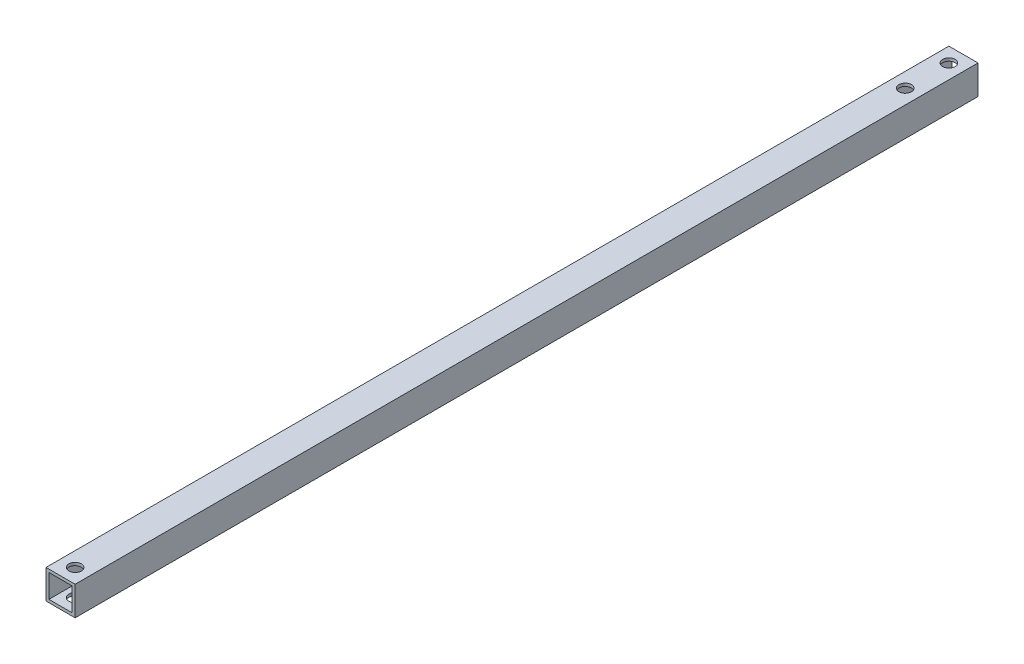
ISO-10303-21;
HEADER;
FILE_DESCRIPTION(('STEP AP214'),'2;1');
FILE_NAME('part.step','',(''),(''),'','','');
FILE_SCHEMA(('AUTOMOTIVE_DESIGN { 1 0 10303 214 1 1 1 1 }'));
ENDSEC;
DATA;
#1=APPLICATION_CONTEXT('core data for automotive mechanical design processes');
#2=APPLICATION_PROTOCOL_DEFINITION('international standard','automotive_design',2000,#1);
#3=PRODUCT_CONTEXT('',#1,'mechanical');
#4=PRODUCT('Part','Part','',(#3));
#5=PRODUCT_RELATED_PRODUCT_CATEGORY('part','',(#4));
#6=PRODUCT_DEFINITION_FORMATION('','',#4);
#7=PRODUCT_DEFINITION_CONTEXT('part definition',#1,'design');
#8=PRODUCT_DEFINITION('design','',#6,#7);
#9=PRODUCT_DEFINITION_SHAPE('','',#8);
#10=(LENGTH_UNIT() NAMED_UNIT(*) SI_UNIT(.MILLI.,.METRE.));
#11=(NAMED_UNIT(*) PLANE_ANGLE_UNIT() SI_UNIT($,.RADIAN.));
#12=(NAMED_UNIT(*) SI_UNIT($,.STERADIAN.) SOLID_ANGLE_UNIT());
#13=UNCERTAINTY_MEASURE_WITH_UNIT(LENGTH_MEASURE(1.E-05),#10,'distance_accuracy_value','');
#14=(GEOMETRIC_REPRESENTATION_CONTEXT(3) GLOBAL_UNCERTAINTY_ASSIGNED_CONTEXT((#13)) GLOBAL_UNIT_ASSIGNED_CONTEXT((#10,
#11,#12)) REPRESENTATION_CONTEXT('',''));
#15=CARTESIAN_POINT('',(0.,0.,0.));
#16=DIRECTION('',(0.,0.,1.));
#17=DIRECTION('',(1.,0.,0.));
#18=AXIS2_PLACEMENT_3D('',#15,#16,#17);
#19=CARTESIAN_POINT('',(0.,0.,310.));
#20=DIRECTION('',(0.,0.,1.));
#21=DIRECTION('',(1.,0.,0.));
#22=AXIS2_PLACEMENT_3D('',#19,#20,#21);
#23=PLANE('',#22);
#24=DIRECTION('',(0.,-1.,0.));
#25=VECTOR('',#24,1.);
#26=CARTESIAN_POINT('',(0.,0.,310.));
#27=LINE('',#26,#25);
#28=CARTESIAN_POINT('',(0.,10.,310.));
#29=VERTEX_POINT('',#28);
#30=CARTESIAN_POINT('',(0.,0.,310.));
#31=VERTEX_POINT('',#30);
#32=EDGE_CURVE('E164',#29,#31,#27,.T.);
#33=ORIENTED_EDGE('',*,*,#32,.T.);
#34=DIRECTION('',(1.,0.,0.));
#35=VECTOR('',#34,1.);
#36=CARTESIAN_POINT('',(0.,0.,310.));
#37=LINE('',#36,#35);
#38=CARTESIAN_POINT('',(10.,0.,310.));
#39=VERTEX_POINT('',#38);
#40=EDGE_CURVE('E167',#31,#39,#37,.T.);
#41=ORIENTED_EDGE('',*,*,#40,.T.);
#42=DIRECTION('',(0.,1.,0.));
#43=VECTOR('',#42,1.);
#44=CARTESIAN_POINT('',(10.,0.,310.));
#45=LINE('',#44,#43);
#46=CARTESIAN_POINT('',(10.,10.,310.));
#47=VERTEX_POINT('',#46);
#48=EDGE_CURVE('E170',#39,#47,#45,.T.);
#49=ORIENTED_EDGE('',*,*,#48,.T.);
#50=DIRECTION('',(-1.,0.,0.));
#51=VECTOR('',#50,1.);
#52=CARTESIAN_POINT('',(0.,10.,310.));
#53=LINE('',#52,#51);
#54=EDGE_CURVE('E172',#47,#29,#53,.T.);
#55=ORIENTED_EDGE('',*,*,#54,.T.);
#56=EDGE_LOOP('',(#33,#41,#49,#55));
#57=FACE_BOUND('',#56,.T.);
#58=DIRECTION('',(1.,0.,0.));
#59=VECTOR('',#58,1.);
#60=CARTESIAN_POINT('',(0.,1.,310.));
#61=LINE('',#60,#59);
#62=CARTESIAN_POINT('',(1.,1.,310.));
#63=VERTEX_POINT('',#62);
#64=CARTESIAN_POINT('',(9.,1.,310.));
#65=VERTEX_POINT('',#64);
#66=EDGE_CURVE('E134',#63,#65,#61,.T.);
#67=ORIENTED_EDGE('',*,*,#66,.F.);
#68=DIRECTION('',(0.,-1.,0.));
#69=VECTOR('',#68,1.);
#70=CARTESIAN_POINT('',(1.,0.,310.));
#71=LINE('',#70,#69);
#72=CARTESIAN_POINT('',(1.,9.,310.));
#73=VERTEX_POINT('',#72);
#74=EDGE_CURVE('E126',#73,#63,#71,.T.);
#75=ORIENTED_EDGE('',*,*,#74,.F.);
#76=DIRECTION('',(-1.,0.,0.));
#77=VECTOR('',#76,1.);
#78=CARTESIAN_POINT('',(0.,9.,310.));
#79=LINE('',#78,#77);
#80=CARTESIAN_POINT('',(9.,9.,310.));
#81=VERTEX_POINT('',#80);
#82=EDGE_CURVE('E148',#81,#73,#79,.T.);
#83=ORIENTED_EDGE('',*,*,#82,.F.);
#84=DIRECTION('',(0.,1.,0.));
#85=VECTOR('',#84,1.);
#86=CARTESIAN_POINT('',(9.,0.,310.));
#87=LINE('',#86,#85);
#88=EDGE_CURVE('E146',#65,#81,#87,.T.);
#89=ORIENTED_EDGE('',*,*,#88,.F.);
#90=EDGE_LOOP('',(#67,#75,#83,#89));
#91=FACE_BOUND('',#90,.T.);
#92=ADVANCED_FACE('F59',(#57,#91),#23,.T.);
#93=CARTESIAN_POINT('',(0.,0.,0.));
#94=DIRECTION('',(0.,0.,1.));
#95=DIRECTION('',(1.,0.,0.));
#96=AXIS2_PLACEMENT_3D('',#93,#94,#95);
#97=PLANE('',#96);
#98=DIRECTION('',(0.,-1.,0.));
#99=VECTOR('',#98,1.);
#100=CARTESIAN_POINT('',(0.,0.,0.));
#101=LINE('',#100,#99);
#102=CARTESIAN_POINT('',(0.,10.,0.));
#103=VERTEX_POINT('',#102);
#104=CARTESIAN_POINT('',(0.,0.,0.));
#105=VERTEX_POINT('',#104);
#106=EDGE_CURVE('E142',#103,#105,#101,.T.);
#107=ORIENTED_EDGE('',*,*,#106,.F.);
#108=DIRECTION('',(-1.,0.,0.));
#109=VECTOR('',#108,1.);
#110=CARTESIAN_POINT('',(0.,10.,0.));
#111=LINE('',#110,#109);
#112=CARTESIAN_POINT('',(10.,10.,0.));
#113=VERTEX_POINT('',#112);
#114=EDGE_CURVE('E168',#113,#103,#111,.T.);
#115=ORIENTED_EDGE('',*,*,#114,.F.);
#116=DIRECTION('',(0.,1.,0.));
#117=VECTOR('',#116,1.);
#118=CARTESIAN_POINT('',(10.,0.,0.));
#119=LINE('',#118,#117);
#120=CARTESIAN_POINT('',(10.,0.,0.));
#121=VERTEX_POINT('',#120);
#122=EDGE_CURVE('E179',#121,#113,#119,.T.);
#123=ORIENTED_EDGE('',*,*,#122,.F.);
#124=DIRECTION('',(1.,0.,0.));
#125=VECTOR('',#124,1.);
#126=CARTESIAN_POINT('',(0.,0.,0.));
#127=LINE('',#126,#125);
#128=EDGE_CURVE('E177',#105,#121,#127,.T.);
#129=ORIENTED_EDGE('',*,*,#128,.F.);
#130=EDGE_LOOP('',(#107,#115,#123,#129));
#131=FACE_BOUND('',#130,.T.);
#132=DIRECTION('',(0.,-1.,0.));
#133=VECTOR('',#132,1.);
#134=CARTESIAN_POINT('',(1.,0.,0.));
#135=LINE('',#134,#133);
#136=CARTESIAN_POINT('',(1.,9.,0.));
#137=VERTEX_POINT('',#136);
#138=CARTESIAN_POINT('',(1.,1.,0.));
#139=VERTEX_POINT('',#138);
#140=EDGE_CURVE('E84',#137,#139,#135,.T.);
#141=ORIENTED_EDGE('',*,*,#140,.T.);
#142=DIRECTION('',(1.,0.,0.));
#143=VECTOR('',#142,1.);
#144=CARTESIAN_POINT('',(0.,1.,0.));
#145=LINE('',#144,#143);
#146=CARTESIAN_POINT('',(9.,1.,0.));
#147=VERTEX_POINT('',#146);
#148=EDGE_CURVE('E141',#139,#147,#145,.T.);
#149=ORIENTED_EDGE('',*,*,#148,.T.);
#150=DIRECTION('',(0.,1.,0.));
#151=VECTOR('',#150,1.);
#152=CARTESIAN_POINT('',(9.,0.,0.));
#153=LINE('',#152,#151);
#154=CARTESIAN_POINT('',(9.,9.,0.));
#155=VERTEX_POINT('',#154);
#156=EDGE_CURVE('E156',#147,#155,#153,.T.);
#157=ORIENTED_EDGE('',*,*,#156,.T.);
#158=DIRECTION('',(-1.,0.,0.));
#159=VECTOR('',#158,1.);
#160=CARTESIAN_POINT('',(0.,9.,0.));
#161=LINE('',#160,#159);
#162=EDGE_CURVE('E135',#155,#137,#161,.T.);
#163=ORIENTED_EDGE('',*,*,#162,.T.);
#164=EDGE_LOOP('',(#141,#149,#157,#163));
#165=FACE_BOUND('',#164,.T.);
#166=ADVANCED_FACE('F226',(#131,#165),#97,.F.);
#167=CARTESIAN_POINT('',(0.,0.,310.));
#168=DIRECTION('',(1.,0.,0.));
#169=DIRECTION('',(0.,0.,-1.));
#170=AXIS2_PLACEMENT_3D('',#167,#168,#169);
#171=PLANE('',#170);
#172=ORIENTED_EDGE('',*,*,#106,.T.);
#173=DIRECTION('',(0.,0.,-1.));
#174=VECTOR('',#173,1.);
#175=CARTESIAN_POINT('',(0.,0.,310.));
#176=LINE('',#175,#174);
#177=EDGE_CURVE('E12',#31,#105,#176,.T.);
#178=ORIENTED_EDGE('',*,*,#177,.F.);
#179=ORIENTED_EDGE('',*,*,#32,.F.);
#180=DIRECTION('',(0.,0.,-1.));
#181=VECTOR('',#180,1.);
#182=CARTESIAN_POINT('',(0.,10.,310.));
#183=LINE('',#182,#181);
#184=EDGE_CURVE('E174',#29,#103,#183,.T.);
#185=ORIENTED_EDGE('',*,*,#184,.T.);
#186=EDGE_LOOP('',(#172,#178,#179,#185));
#187=FACE_BOUND('',#186,.T.);
#188=ADVANCED_FACE('F61',(#187),#171,.F.);
#189=CARTESIAN_POINT('',(0.,0.,310.));
#190=DIRECTION('',(0.,1.,0.));
#191=DIRECTION('',(0.,0.,1.));
#192=AXIS2_PLACEMENT_3D('',#189,#190,#191);
#193=PLANE('',#192);
#194=CARTESIAN_POINT('',(5.00000000000004,0.,305.));
#195=DIRECTION('',(0.,1.,0.));
#196=DIRECTION('',(0.,0.,1.));
#197=AXIS2_PLACEMENT_3D('',#194,#195,#196);
#198=CIRCLE('',#197,2.15000000000003);
#199=CARTESIAN_POINT('',(5.00000000000004,0.,307.15));
#200=VERTEX_POINT('',#199);
#201=EDGE_CURVE('E192',#200,#200,#198,.F.);
#202=ORIENTED_EDGE('',*,*,#201,.F.);
#203=EDGE_LOOP('',(#202));
#204=FACE_BOUND('',#203,.T.);
#205=CARTESIAN_POINT('',(5.00000000000003,0.,5.));
#206=DIRECTION('',(0.,1.,0.));
#207=DIRECTION('',(0.,0.,1.));
#208=AXIS2_PLACEMENT_3D('',#205,#206,#207);
#209=CIRCLE('',#208,2.15000000000001);
#210=CARTESIAN_POINT('',(5.00000000000003,0.,7.15000000000001));
#211=VERTEX_POINT('',#210);
#212=EDGE_CURVE('E265',#211,#211,#209,.F.);
#213=ORIENTED_EDGE('',*,*,#212,.F.);
#214=EDGE_LOOP('',(#213));
#215=FACE_BOUND('',#214,.T.);
#216=CARTESIAN_POINT('',(5.,0.,20.));
#217=DIRECTION('',(0.,1.,0.));
#218=DIRECTION('',(0.,0.,1.));
#219=AXIS2_PLACEMENT_3D('',#216,#217,#218);
#220=CIRCLE('',#219,2.15);
#221=CARTESIAN_POINT('',(5.,0.,22.15));
#222=VERTEX_POINT('',#221);
#223=EDGE_CURVE('E205',#222,#222,#220,.F.);
#224=ORIENTED_EDGE('',*,*,#223,.F.);
#225=EDGE_LOOP('',(#224));
#226=FACE_BOUND('',#225,.T.);
#227=ORIENTED_EDGE('',*,*,#128,.T.);
#228=DIRECTION('',(0.,0.,-1.));
#229=VECTOR('',#228,1.);
#230=CARTESIAN_POINT('',(10.,0.,310.));
#231=LINE('',#230,#229);
#232=EDGE_CURVE('E68',#39,#121,#231,.T.);
#233=ORIENTED_EDGE('',*,*,#232,.F.);
#234=ORIENTED_EDGE('',*,*,#40,.F.);
#235=ORIENTED_EDGE('',*,*,#177,.T.);
#236=EDGE_LOOP('',(#227,#233,#234,#235));
#237=FACE_BOUND('',#236,.T.);
#238=ADVANCED_FACE('F251',(#204,#215,#226,#237),#193,.F.);
#239=CARTESIAN_POINT('',(10.,0.,310.));
#240=DIRECTION('',(-1.,0.,0.));
#241=DIRECTION('',(0.,0.,1.));
#242=AXIS2_PLACEMENT_3D('',#239,#240,#241);
#243=PLANE('',#242);
#244=ORIENTED_EDGE('',*,*,#122,.T.);
#245=DIRECTION('',(0.,0.,-1.));
#246=VECTOR('',#245,1.);
#247=CARTESIAN_POINT('',(10.,10.,310.));
#248=LINE('',#247,#246);
#249=EDGE_CURVE('E184',#47,#113,#248,.T.);
#250=ORIENTED_EDGE('',*,*,#249,.F.);
#251=ORIENTED_EDGE('',*,*,#48,.F.);
#252=ORIENTED_EDGE('',*,*,#232,.T.);
#253=EDGE_LOOP('',(#244,#250,#251,#252));
#254=FACE_BOUND('',#253,.T.);
#255=ADVANCED_FACE('F248',(#254),#243,.F.);
#256=CARTESIAN_POINT('',(0.,10.,310.));
#257=DIRECTION('',(0.,-1.,0.));
#258=DIRECTION('',(0.,0.,-1.));
#259=AXIS2_PLACEMENT_3D('',#256,#257,#258);
#260=PLANE('',#259);
#261=CARTESIAN_POINT('',(5.00000000000004,10.,305.));
#262=DIRECTION('',(0.,1.,0.));
#263=DIRECTION('',(0.,0.,1.));
#264=AXIS2_PLACEMENT_3D('',#261,#262,#263);
#265=CIRCLE('',#264,2.15000000000003);
#266=CARTESIAN_POINT('',(5.00000000000004,10.,307.15));
#267=VERTEX_POINT('',#266);
#268=EDGE_CURVE('E289',#267,#267,#265,.T.);
#269=ORIENTED_EDGE('',*,*,#268,.F.);
#270=EDGE_LOOP('',(#269));
#271=FACE_BOUND('',#270,.T.);
#272=CARTESIAN_POINT('',(5.00000000000003,10.,5.));
#273=DIRECTION('',(0.,1.,0.));
#274=DIRECTION('',(0.,0.,-1.));
#275=AXIS2_PLACEMENT_3D('',#272,#273,#274);
#276=CIRCLE('',#275,2.15000000000001);
#277=CARTESIAN_POINT('',(5.00000000000003,10.,2.85));
#278=VERTEX_POINT('',#277);
#279=EDGE_CURVE('E281',#278,#278,#276,.T.);
#280=ORIENTED_EDGE('',*,*,#279,.F.);
#281=EDGE_LOOP('',(#280));
#282=FACE_BOUND('',#281,.T.);
#283=CARTESIAN_POINT('',(5.,10.,20.));
#284=DIRECTION('',(0.,1.,0.));
#285=DIRECTION('',(0.,0.,1.));
#286=AXIS2_PLACEMENT_3D('',#283,#284,#285);
#287=CIRCLE('',#286,2.15);
#288=CARTESIAN_POINT('',(5.,10.,22.15));
#289=VERTEX_POINT('',#288);
#290=EDGE_CURVE('E282',#289,#289,#287,.T.);
#291=ORIENTED_EDGE('',*,*,#290,.F.);
#292=EDGE_LOOP('',(#291));
#293=FACE_BOUND('',#292,.T.);
#294=ORIENTED_EDGE('',*,*,#114,.T.);
#295=ORIENTED_EDGE('',*,*,#184,.F.);
#296=ORIENTED_EDGE('',*,*,#54,.F.);
#297=ORIENTED_EDGE('',*,*,#249,.T.);
#298=EDGE_LOOP('',(#294,#295,#296,#297));
#299=FACE_BOUND('',#298,.T.);
#300=ADVANCED_FACE('F245',(#271,#282,#293,#299),#260,.F.);
#301=CARTESIAN_POINT('',(1.,0.,310.));
#302=DIRECTION('',(1.,0.,0.));
#303=DIRECTION('',(0.,0.,-1.));
#304=AXIS2_PLACEMENT_3D('',#301,#302,#303);
#305=PLANE('',#304);
#306=ORIENTED_EDGE('',*,*,#140,.F.);
#307=DIRECTION('',(0.,0.,-1.));
#308=VECTOR('',#307,1.);
#309=CARTESIAN_POINT('',(1.,9.,310.));
#310=LINE('',#309,#308);
#311=EDGE_CURVE('E130',#73,#137,#310,.T.);
#312=ORIENTED_EDGE('',*,*,#311,.F.);
#313=ORIENTED_EDGE('',*,*,#74,.T.);
#314=DIRECTION('',(0.,0.,-1.));
#315=VECTOR('',#314,1.);
#316=CARTESIAN_POINT('',(1.,1.,310.));
#317=LINE('',#316,#315);
#318=EDGE_CURVE('E129',#63,#139,#317,.T.);
#319=ORIENTED_EDGE('',*,*,#318,.T.);
#320=EDGE_LOOP('',(#306,#312,#313,#319));
#321=FACE_BOUND('',#320,.T.);
#322=ADVANCED_FACE('F128',(#321),#305,.T.);
#323=CARTESIAN_POINT('',(0.,1.,310.));
#324=DIRECTION('',(0.,1.,0.));
#325=DIRECTION('',(0.,0.,1.));
#326=AXIS2_PLACEMENT_3D('',#323,#324,#325);
#327=PLANE('',#326);
#328=CARTESIAN_POINT('',(5.00000000000004,1.,305.));
#329=DIRECTION('',(0.,1.,0.));
#330=DIRECTION('',(0.,0.,1.));
#331=AXIS2_PLACEMENT_3D('',#328,#329,#330);
#332=CIRCLE('',#331,2.15000000000003);
#333=CARTESIAN_POINT('',(5.00000000000004,1.,307.15));
#334=VERTEX_POINT('',#333);
#335=EDGE_CURVE('E154',#334,#334,#332,.T.);
#336=ORIENTED_EDGE('',*,*,#335,.F.);
#337=EDGE_LOOP('',(#336));
#338=FACE_BOUND('',#337,.T.);
#339=CARTESIAN_POINT('',(5.00000000000003,1.,5.));
#340=DIRECTION('',(0.,1.,0.));
#341=DIRECTION('',(0.,0.,1.));
#342=AXIS2_PLACEMENT_3D('',#339,#340,#341);
#343=CIRCLE('',#342,2.15000000000001);
#344=CARTESIAN_POINT('',(5.00000000000003,1.,7.15000000000001));
#345=VERTEX_POINT('',#344);
#346=EDGE_CURVE('E195',#345,#345,#343,.T.);
#347=ORIENTED_EDGE('',*,*,#346,.F.);
#348=EDGE_LOOP('',(#347));
#349=FACE_BOUND('',#348,.T.);
#350=CARTESIAN_POINT('',(5.,1.,20.));
#351=DIRECTION('',(0.,1.,0.));
#352=DIRECTION('',(0.,0.,1.));
#353=AXIS2_PLACEMENT_3D('',#350,#351,#352);
#354=CIRCLE('',#353,2.15);
#355=CARTESIAN_POINT('',(5.,1.,22.15));
#356=VERTEX_POINT('',#355);
#357=EDGE_CURVE('E191',#356,#356,#354,.T.);
#358=ORIENTED_EDGE('',*,*,#357,.F.);
#359=EDGE_LOOP('',(#358));
#360=FACE_BOUND('',#359,.T.);
#361=ORIENTED_EDGE('',*,*,#148,.F.);
#362=ORIENTED_EDGE('',*,*,#318,.F.);
#363=ORIENTED_EDGE('',*,*,#66,.T.);
#364=DIRECTION('',(0.,0.,-1.));
#365=VECTOR('',#364,1.);
#366=CARTESIAN_POINT('',(9.,1.,310.));
#367=LINE('',#366,#365);
#368=EDGE_CURVE('E143',#65,#147,#367,.T.);
#369=ORIENTED_EDGE('',*,*,#368,.T.);
#370=EDGE_LOOP('',(#361,#362,#363,#369));
#371=FACE_BOUND('',#370,.T.);
#372=ADVANCED_FACE('F138',(#338,#349,#360,#371),#327,.T.);
#373=CARTESIAN_POINT('',(9.,0.,310.));
#374=DIRECTION('',(-1.,0.,0.));
#375=DIRECTION('',(0.,0.,1.));
#376=AXIS2_PLACEMENT_3D('',#373,#374,#375);
#377=PLANE('',#376);
#378=ORIENTED_EDGE('',*,*,#156,.F.);
#379=ORIENTED_EDGE('',*,*,#368,.F.);
#380=ORIENTED_EDGE('',*,*,#88,.T.);
#381=DIRECTION('',(0.,0.,-1.));
#382=VECTOR('',#381,1.);
#383=CARTESIAN_POINT('',(9.,9.,310.));
#384=LINE('',#383,#382);
#385=EDGE_CURVE('E76',#81,#155,#384,.T.);
#386=ORIENTED_EDGE('',*,*,#385,.T.);
#387=EDGE_LOOP('',(#378,#379,#380,#386));
#388=FACE_BOUND('',#387,.T.);
#389=ADVANCED_FACE('F220',(#388),#377,.T.);
#390=CARTESIAN_POINT('',(0.,9.,310.));
#391=DIRECTION('',(0.,-1.,0.));
#392=DIRECTION('',(0.,0.,-1.));
#393=AXIS2_PLACEMENT_3D('',#390,#391,#392);
#394=PLANE('',#393);
#395=CARTESIAN_POINT('',(5.00000000000004,9.,305.));
#396=DIRECTION('',(0.,-1.,0.));
#397=DIRECTION('',(0.,0.,-1.));
#398=AXIS2_PLACEMENT_3D('',#395,#396,#397);
#399=CIRCLE('',#398,2.15000000000003);
#400=CARTESIAN_POINT('',(5.00000000000004,9.,302.85));
#401=VERTEX_POINT('',#400);
#402=EDGE_CURVE('E63',#401,#401,#399,.T.);
#403=ORIENTED_EDGE('',*,*,#402,.F.);
#404=EDGE_LOOP('',(#403));
#405=FACE_BOUND('',#404,.T.);
#406=CARTESIAN_POINT('',(5.00000000000003,9.,5.));
#407=DIRECTION('',(0.,-1.,0.));
#408=DIRECTION('',(0.,0.,-1.));
#409=AXIS2_PLACEMENT_3D('',#406,#407,#408);
#410=CIRCLE('',#409,2.15000000000001);
#411=CARTESIAN_POINT('',(5.00000000000003,9.,2.85));
#412=VERTEX_POINT('',#411);
#413=EDGE_CURVE('E193',#412,#412,#410,.T.);
#414=ORIENTED_EDGE('',*,*,#413,.F.);
#415=EDGE_LOOP('',(#414));
#416=FACE_BOUND('',#415,.T.);
#417=CARTESIAN_POINT('',(5.,9.,20.));
#418=DIRECTION('',(0.,-1.,0.));
#419=DIRECTION('',(0.,0.,-1.));
#420=AXIS2_PLACEMENT_3D('',#417,#418,#419);
#421=CIRCLE('',#420,2.15);
#422=CARTESIAN_POINT('',(5.,9.,17.85));
#423=VERTEX_POINT('',#422);
#424=EDGE_CURVE('E189',#423,#423,#421,.T.);
#425=ORIENTED_EDGE('',*,*,#424,.F.);
#426=EDGE_LOOP('',(#425));
#427=FACE_BOUND('',#426,.T.);
#428=ORIENTED_EDGE('',*,*,#162,.F.);
#429=ORIENTED_EDGE('',*,*,#385,.F.);
#430=ORIENTED_EDGE('',*,*,#82,.T.);
#431=ORIENTED_EDGE('',*,*,#311,.T.);
#432=EDGE_LOOP('',(#428,#429,#430,#431));
#433=FACE_BOUND('',#432,.T.);
#434=ADVANCED_FACE('F216',(#405,#416,#427,#433),#394,.T.);
#435=CARTESIAN_POINT('',(5.,-6.08111831820441,20.));
#436=DIRECTION('',(0.,1.,0.));
#437=DIRECTION('',(0.,0.,1.));
#438=AXIS2_PLACEMENT_3D('',#435,#436,#437);
#439=CYLINDRICAL_SURFACE('',#438,2.15);
#440=ORIENTED_EDGE('',*,*,#424,.T.);
#441=EDGE_LOOP('',(#440));
#442=FACE_BOUND('',#441,.T.);
#443=ORIENTED_EDGE('',*,*,#290,.T.);
#444=EDGE_LOOP('',(#443));
#445=FACE_BOUND('',#444,.T.);
#446=ADVANCED_FACE('F219',(#442,#445),#439,.F.);
#447=CARTESIAN_POINT('',(5.00000000000003,-6.08111831820441,5.));
#448=DIRECTION('',(0.,1.,0.));
#449=DIRECTION('',(0.,0.,1.));
#450=AXIS2_PLACEMENT_3D('',#447,#448,#449);
#451=CYLINDRICAL_SURFACE('',#450,2.15000000000001);
#452=ORIENTED_EDGE('',*,*,#413,.T.);
#453=EDGE_LOOP('',(#452));
#454=FACE_BOUND('',#453,.T.);
#455=ORIENTED_EDGE('',*,*,#279,.T.);
#456=EDGE_LOOP('',(#455));
#457=FACE_BOUND('',#456,.T.);
#458=ADVANCED_FACE('F298',(#454,#457),#451,.F.);
#459=CARTESIAN_POINT('',(5.00000000000004,-6.08111831820441,305.));
#460=DIRECTION('',(0.,1.,0.));
#461=DIRECTION('',(0.,0.,1.));
#462=AXIS2_PLACEMENT_3D('',#459,#460,#461);
#463=CYLINDRICAL_SURFACE('',#462,2.15000000000003);
#464=ORIENTED_EDGE('',*,*,#402,.T.);
#465=EDGE_LOOP('',(#464));
#466=FACE_BOUND('',#465,.T.);
#467=ORIENTED_EDGE('',*,*,#268,.T.);
#468=EDGE_LOOP('',(#467));
#469=FACE_BOUND('',#468,.T.);
#470=ADVANCED_FACE('F213',(#466,#469),#463,.F.);
#471=ORIENTED_EDGE('',*,*,#357,.T.);
#472=EDGE_LOOP('',(#471));
#473=FACE_BOUND('',#472,.T.);
#474=ORIENTED_EDGE('',*,*,#223,.T.);
#475=EDGE_LOOP('',(#474));
#476=FACE_BOUND('',#475,.T.);
#477=ADVANCED_FACE('F306',(#473,#476),#439,.F.);
#478=ORIENTED_EDGE('',*,*,#346,.T.);
#479=EDGE_LOOP('',(#478));
#480=FACE_BOUND('',#479,.T.);
#481=ORIENTED_EDGE('',*,*,#212,.T.);
#482=EDGE_LOOP('',(#481));
#483=FACE_BOUND('',#482,.T.);
#484=ADVANCED_FACE('F301',(#480,#483),#451,.F.);
#485=ORIENTED_EDGE('',*,*,#335,.T.);
#486=EDGE_LOOP('',(#485));
#487=FACE_BOUND('',#486,.T.);
#488=ORIENTED_EDGE('',*,*,#201,.T.);
#489=EDGE_LOOP('',(#488));
#490=FACE_BOUND('',#489,.T.);
#491=ADVANCED_FACE('F308',(#487,#490),#463,.F.);
#492=CLOSED_SHELL('',(#92,#166,#188,#238,#255,#300,#322,#372,#389,#434,#446,#458,#470,#477,#484,#491));
#493=MANIFOLD_SOLID_BREP('B2',#492);
#494=ADVANCED_BREP_SHAPE_REPRESENTATION('',(#18,#493),#14);
#495=SHAPE_DEFINITION_REPRESENTATION(#9,#494);
ENDSEC;
END-ISO-10303-21;
